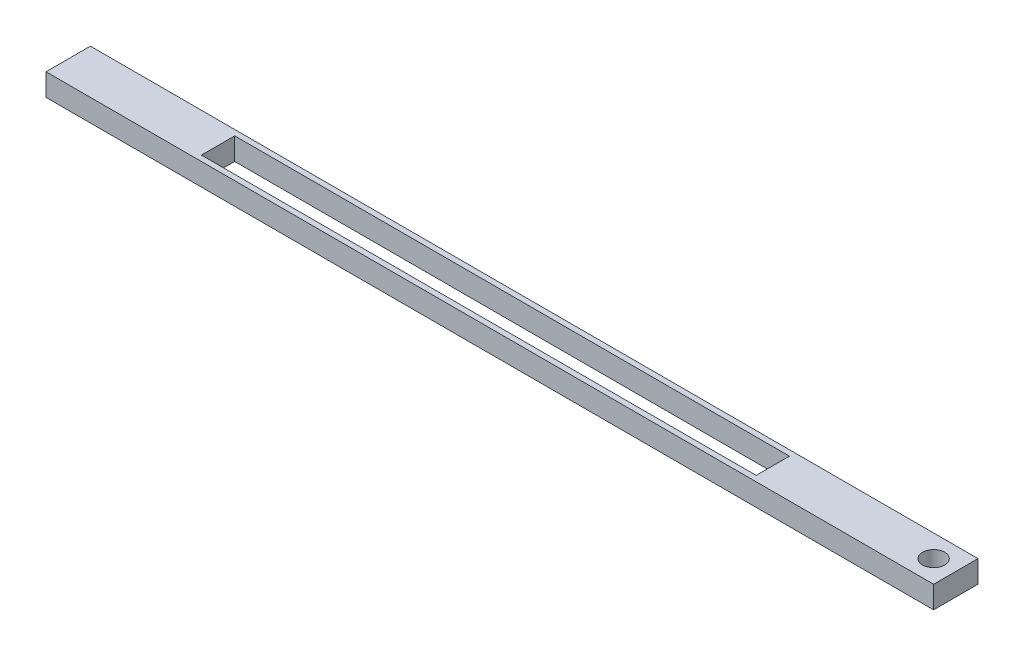
ISO-10303-21;
HEADER;
FILE_DESCRIPTION(('STEP AP214'),'2;1');
FILE_NAME('part.step','',(''),(''),'','','');
FILE_SCHEMA(('AUTOMOTIVE_DESIGN { 1 0 10303 214 1 1 1 1 }'));
ENDSEC;
DATA;
#1=APPLICATION_CONTEXT('core data for automotive mechanical design processes');
#2=APPLICATION_PROTOCOL_DEFINITION('international standard','automotive_design',2000,#1);
#3=PRODUCT_CONTEXT('',#1,'mechanical');
#4=PRODUCT('Part','Part','',(#3));
#5=PRODUCT_RELATED_PRODUCT_CATEGORY('part','',(#4));
#6=PRODUCT_DEFINITION_FORMATION('','',#4);
#7=PRODUCT_DEFINITION_CONTEXT('part definition',#1,'design');
#8=PRODUCT_DEFINITION('design','',#6,#7);
#9=PRODUCT_DEFINITION_SHAPE('','',#8);
#10=(LENGTH_UNIT() NAMED_UNIT(*) SI_UNIT(.MILLI.,.METRE.));
#11=(NAMED_UNIT(*) PLANE_ANGLE_UNIT() SI_UNIT($,.RADIAN.));
#12=(NAMED_UNIT(*) SI_UNIT($,.STERADIAN.) SOLID_ANGLE_UNIT());
#13=UNCERTAINTY_MEASURE_WITH_UNIT(LENGTH_MEASURE(1.E-05),#10,'distance_accuracy_value','');
#14=(GEOMETRIC_REPRESENTATION_CONTEXT(3) GLOBAL_UNCERTAINTY_ASSIGNED_CONTEXT((#13)) GLOBAL_UNIT_ASSIGNED_CONTEXT((#10,
#11,#12)) REPRESENTATION_CONTEXT('',''));
#15=CARTESIAN_POINT('',(0.,0.,0.));
#16=DIRECTION('',(0.,0.,1.));
#17=DIRECTION('',(1.,0.,0.));
#18=AXIS2_PLACEMENT_3D('',#15,#16,#17);
#19=CARTESIAN_POINT('',(200.,-5.,20.));
#20=DIRECTION('',(-1.,0.,0.));
#21=DIRECTION('',(0.,0.,1.));
#22=AXIS2_PLACEMENT_3D('',#19,#20,#21);
#23=PLANE('',#22);
#24=DIRECTION('',(0.,1.,0.));
#25=VECTOR('',#24,1.);
#26=CARTESIAN_POINT('',(200.,-5.,0.));
#27=LINE('',#26,#25);
#28=CARTESIAN_POINT('',(200.,-5.,0.));
#29=VERTEX_POINT('',#28);
#30=CARTESIAN_POINT('',(200.,5.,0.));
#31=VERTEX_POINT('',#30);
#32=EDGE_CURVE('E136',#29,#31,#27,.T.);
#33=ORIENTED_EDGE('',*,*,#32,.T.);
#34=DIRECTION('',(0.,0.,-1.));
#35=VECTOR('',#34,1.);
#36=CARTESIAN_POINT('',(200.,5.,20.));
#37=LINE('',#36,#35);
#38=CARTESIAN_POINT('',(200.,5.,20.));
#39=VERTEX_POINT('',#38);
#40=EDGE_CURVE('E178',#39,#31,#37,.T.);
#41=ORIENTED_EDGE('',*,*,#40,.F.);
#42=DIRECTION('',(0.,1.,0.));
#43=VECTOR('',#42,1.);
#44=CARTESIAN_POINT('',(200.,-5.,20.));
#45=LINE('',#44,#43);
#46=CARTESIAN_POINT('',(200.,-5.,20.));
#47=VERTEX_POINT('',#46);
#48=EDGE_CURVE('E141',#47,#39,#45,.T.);
#49=ORIENTED_EDGE('',*,*,#48,.F.);
#50=DIRECTION('',(0.,0.,-1.));
#51=VECTOR('',#50,1.);
#52=CARTESIAN_POINT('',(200.,-5.,20.));
#53=LINE('',#52,#51);
#54=EDGE_CURVE('E155',#47,#29,#53,.T.);
#55=ORIENTED_EDGE('',*,*,#54,.T.);
#56=EDGE_LOOP('',(#33,#41,#49,#55));
#57=FACE_BOUND('',#56,.T.);
#58=ADVANCED_FACE('F39',(#57),#23,.F.);
#59=CARTESIAN_POINT('',(-200.,5.,20.));
#60=DIRECTION('',(0.,-1.,0.));
#61=DIRECTION('',(0.,0.,-1.));
#62=AXIS2_PLACEMENT_3D('',#59,#60,#61);
#63=PLANE('',#62);
#64=CARTESIAN_POINT('',(190.,5.,10.));
#65=DIRECTION('',(0.,1.,0.));
#66=DIRECTION('',(0.,0.,1.));
#67=AXIS2_PLACEMENT_3D('',#64,#65,#66);
#68=CIRCLE('',#67,5.00000000000002);
#69=CARTESIAN_POINT('',(190.,5.,15.));
#70=VERTEX_POINT('',#69);
#71=EDGE_CURVE('E298',#70,#70,#68,.T.);
#72=ORIENTED_EDGE('',*,*,#71,.F.);
#73=EDGE_LOOP('',(#72));
#74=FACE_BOUND('',#73,.T.);
#75=DIRECTION('',(-1.,0.,0.));
#76=VECTOR('',#75,1.);
#77=CARTESIAN_POINT('',(-132.46371867266,5.,2.5));
#78=LINE('',#77,#76);
#79=CARTESIAN_POINT('',(117.53628132734,5.,2.5));
#80=VERTEX_POINT('',#79);
#81=CARTESIAN_POINT('',(-132.46371867266,5.,2.5));
#82=VERTEX_POINT('',#81);
#83=EDGE_CURVE('E118',#80,#82,#78,.T.);
#84=ORIENTED_EDGE('',*,*,#83,.F.);
#85=DIRECTION('',(0.,0.,-1.));
#86=VECTOR('',#85,1.);
#87=CARTESIAN_POINT('',(117.53628132734,5.,17.5));
#88=LINE('',#87,#86);
#89=CARTESIAN_POINT('',(117.53628132734,5.,17.5));
#90=VERTEX_POINT('',#89);
#91=EDGE_CURVE('E55',#90,#80,#88,.T.);
#92=ORIENTED_EDGE('',*,*,#91,.F.);
#93=DIRECTION('',(1.,0.,0.));
#94=VECTOR('',#93,1.);
#95=CARTESIAN_POINT('',(-132.46371867266,5.,17.5));
#96=LINE('',#95,#94);
#97=CARTESIAN_POINT('',(-132.46371867266,5.,17.5));
#98=VERTEX_POINT('',#97);
#99=EDGE_CURVE('E126',#98,#90,#96,.T.);
#100=ORIENTED_EDGE('',*,*,#99,.F.);
#101=DIRECTION('',(0.,0.,1.));
#102=VECTOR('',#101,1.);
#103=CARTESIAN_POINT('',(-132.46371867266,5.,17.5));
#104=LINE('',#103,#102);
#105=EDGE_CURVE('E108',#82,#98,#104,.T.);
#106=ORIENTED_EDGE('',*,*,#105,.F.);
#107=EDGE_LOOP('',(#84,#92,#100,#106));
#108=FACE_BOUND('',#107,.T.);
#109=DIRECTION('',(-1.,0.,0.));
#110=VECTOR('',#109,1.);
#111=CARTESIAN_POINT('',(-200.,5.,0.));
#112=LINE('',#111,#110);
#113=CARTESIAN_POINT('',(-200.,5.,0.));
#114=VERTEX_POINT('',#113);
#115=EDGE_CURVE('E159',#31,#114,#112,.T.);
#116=ORIENTED_EDGE('',*,*,#115,.T.);
#117=DIRECTION('',(0.,0.,-1.));
#118=VECTOR('',#117,1.);
#119=CARTESIAN_POINT('',(-200.,5.,20.));
#120=LINE('',#119,#118);
#121=CARTESIAN_POINT('',(-200.,5.,20.));
#122=VERTEX_POINT('',#121);
#123=EDGE_CURVE('E174',#122,#114,#120,.T.);
#124=ORIENTED_EDGE('',*,*,#123,.F.);
#125=DIRECTION('',(-1.,0.,0.));
#126=VECTOR('',#125,1.);
#127=CARTESIAN_POINT('',(-200.,5.,20.));
#128=LINE('',#127,#126);
#129=EDGE_CURVE('E145',#39,#122,#128,.T.);
#130=ORIENTED_EDGE('',*,*,#129,.F.);
#131=ORIENTED_EDGE('',*,*,#40,.T.);
#132=EDGE_LOOP('',(#116,#124,#130,#131));
#133=FACE_BOUND('',#132,.T.);
#134=ADVANCED_FACE('F123',(#74,#108,#133),#63,.F.);
#135=CARTESIAN_POINT('',(-200.,-5.,20.));
#136=DIRECTION('',(1.,0.,0.));
#137=DIRECTION('',(0.,0.,-1.));
#138=AXIS2_PLACEMENT_3D('',#135,#136,#137);
#139=PLANE('',#138);
#140=DIRECTION('',(0.,-1.,0.));
#141=VECTOR('',#140,1.);
#142=CARTESIAN_POINT('',(-200.,-5.,0.));
#143=LINE('',#142,#141);
#144=CARTESIAN_POINT('',(-200.,-5.,0.));
#145=VERTEX_POINT('',#144);
#146=EDGE_CURVE('E162',#114,#145,#143,.T.);
#147=ORIENTED_EDGE('',*,*,#146,.T.);
#148=DIRECTION('',(0.,0.,-1.));
#149=VECTOR('',#148,1.);
#150=CARTESIAN_POINT('',(-200.,-5.,20.));
#151=LINE('',#150,#149);
#152=CARTESIAN_POINT('',(-200.,-5.,20.));
#153=VERTEX_POINT('',#152);
#154=EDGE_CURVE('E170',#153,#145,#151,.T.);
#155=ORIENTED_EDGE('',*,*,#154,.F.);
#156=DIRECTION('',(0.,-1.,0.));
#157=VECTOR('',#156,1.);
#158=CARTESIAN_POINT('',(-200.,-5.,20.));
#159=LINE('',#158,#157);
#160=EDGE_CURVE('E149',#122,#153,#159,.T.);
#161=ORIENTED_EDGE('',*,*,#160,.F.);
#162=ORIENTED_EDGE('',*,*,#123,.T.);
#163=EDGE_LOOP('',(#147,#155,#161,#162));
#164=FACE_BOUND('',#163,.T.);
#165=ADVANCED_FACE('F214',(#164),#139,.F.);
#166=CARTESIAN_POINT('',(-200.,-5.,20.));
#167=DIRECTION('',(0.,1.,0.));
#168=DIRECTION('',(0.,0.,1.));
#169=AXIS2_PLACEMENT_3D('',#166,#167,#168);
#170=PLANE('',#169);
#171=CARTESIAN_POINT('',(190.,-5.,10.));
#172=DIRECTION('',(0.,1.,0.));
#173=DIRECTION('',(0.,0.,1.));
#174=AXIS2_PLACEMENT_3D('',#171,#172,#173);
#175=CIRCLE('',#174,5.00000000000002);
#176=CARTESIAN_POINT('',(190.,-5.,15.));
#177=VERTEX_POINT('',#176);
#178=EDGE_CURVE('E42',#177,#177,#175,.T.);
#179=ORIENTED_EDGE('',*,*,#178,.T.);
#180=EDGE_LOOP('',(#179));
#181=FACE_BOUND('',#180,.T.);
#182=DIRECTION('',(1.,0.,0.));
#183=VECTOR('',#182,1.);
#184=CARTESIAN_POINT('',(-200.,-5.,17.5));
#185=LINE('',#184,#183);
#186=CARTESIAN_POINT('',(-132.46371867266,-5.,17.5));
#187=VERTEX_POINT('',#186);
#188=CARTESIAN_POINT('',(117.53628132734,-5.,17.5));
#189=VERTEX_POINT('',#188);
#190=EDGE_CURVE('E48',#187,#189,#185,.T.);
#191=ORIENTED_EDGE('',*,*,#190,.T.);
#192=DIRECTION('',(0.,0.,-1.));
#193=VECTOR('',#192,1.);
#194=CARTESIAN_POINT('',(117.53628132734,-5.,20.));
#195=LINE('',#194,#193);
#196=CARTESIAN_POINT('',(117.53628132734,-5.,2.5));
#197=VERTEX_POINT('',#196);
#198=EDGE_CURVE('E11',#189,#197,#195,.T.);
#199=ORIENTED_EDGE('',*,*,#198,.T.);
#200=DIRECTION('',(-1.,0.,0.));
#201=VECTOR('',#200,1.);
#202=CARTESIAN_POINT('',(-200.,-5.,2.5));
#203=LINE('',#202,#201);
#204=CARTESIAN_POINT('',(-132.46371867266,-5.,2.5));
#205=VERTEX_POINT('',#204);
#206=EDGE_CURVE('E182',#197,#205,#203,.T.);
#207=ORIENTED_EDGE('',*,*,#206,.T.);
#208=DIRECTION('',(0.,0.,1.));
#209=VECTOR('',#208,1.);
#210=CARTESIAN_POINT('',(-132.46371867266,-5.,20.));
#211=LINE('',#210,#209);
#212=EDGE_CURVE('E111',#205,#187,#211,.T.);
#213=ORIENTED_EDGE('',*,*,#212,.T.);
#214=EDGE_LOOP('',(#191,#199,#207,#213));
#215=FACE_BOUND('',#214,.T.);
#216=DIRECTION('',(1.,0.,0.));
#217=VECTOR('',#216,1.);
#218=CARTESIAN_POINT('',(-200.,-5.,0.));
#219=LINE('',#218,#217);
#220=EDGE_CURVE('E146',#145,#29,#219,.T.);
#221=ORIENTED_EDGE('',*,*,#220,.T.);
#222=ORIENTED_EDGE('',*,*,#54,.F.);
#223=DIRECTION('',(1.,0.,0.));
#224=VECTOR('',#223,1.);
#225=CARTESIAN_POINT('',(-200.,-5.,20.));
#226=LINE('',#225,#224);
#227=EDGE_CURVE('E152',#153,#47,#226,.T.);
#228=ORIENTED_EDGE('',*,*,#227,.F.);
#229=ORIENTED_EDGE('',*,*,#154,.T.);
#230=EDGE_LOOP('',(#221,#222,#228,#229));
#231=FACE_BOUND('',#230,.T.);
#232=ADVANCED_FACE('F190',(#181,#215,#231),#170,.F.);
#233=CARTESIAN_POINT('',(0.,0.,20.));
#234=DIRECTION('',(0.,0.,-1.));
#235=DIRECTION('',(-1.,0.,0.));
#236=AXIS2_PLACEMENT_3D('',#233,#234,#235);
#237=PLANE('',#236);
#238=ORIENTED_EDGE('',*,*,#48,.T.);
#239=ORIENTED_EDGE('',*,*,#129,.T.);
#240=ORIENTED_EDGE('',*,*,#160,.T.);
#241=ORIENTED_EDGE('',*,*,#227,.T.);
#242=EDGE_LOOP('',(#238,#239,#240,#241));
#243=FACE_BOUND('',#242,.T.);
#244=ADVANCED_FACE('F204',(#243),#237,.F.);
#245=CARTESIAN_POINT('',(0.,0.,0.));
#246=DIRECTION('',(0.,0.,-1.));
#247=DIRECTION('',(-1.,0.,0.));
#248=AXIS2_PLACEMENT_3D('',#245,#246,#247);
#249=PLANE('',#248);
#250=ORIENTED_EDGE('',*,*,#32,.F.);
#251=ORIENTED_EDGE('',*,*,#220,.F.);
#252=ORIENTED_EDGE('',*,*,#146,.F.);
#253=ORIENTED_EDGE('',*,*,#115,.F.);
#254=EDGE_LOOP('',(#250,#251,#252,#253));
#255=FACE_BOUND('',#254,.T.);
#256=ADVANCED_FACE('F197',(#255),#249,.T.);
#257=CARTESIAN_POINT('',(117.53628132734,-15.,17.5));
#258=DIRECTION('',(1.,0.,0.));
#259=DIRECTION('',(0.,0.,-1.));
#260=AXIS2_PLACEMENT_3D('',#257,#258,#259);
#261=PLANE('',#260);
#262=DIRECTION('',(0.,1.,0.));
#263=VECTOR('',#262,1.);
#264=CARTESIAN_POINT('',(117.53628132734,-15.,17.5));
#265=LINE('',#264,#263);
#266=EDGE_CURVE('E133',#189,#90,#265,.T.);
#267=ORIENTED_EDGE('',*,*,#266,.T.);
#268=ORIENTED_EDGE('',*,*,#91,.T.);
#269=DIRECTION('',(0.,1.,0.));
#270=VECTOR('',#269,1.);
#271=CARTESIAN_POINT('',(117.53628132734,-15.,2.5));
#272=LINE('',#271,#270);
#273=EDGE_CURVE('E115',#197,#80,#272,.T.);
#274=ORIENTED_EDGE('',*,*,#273,.F.);
#275=ORIENTED_EDGE('',*,*,#198,.F.);
#276=EDGE_LOOP('',(#267,#268,#274,#275));
#277=FACE_BOUND('',#276,.T.);
#278=ADVANCED_FACE('F195',(#277),#261,.F.);
#279=CARTESIAN_POINT('',(-132.46371867266,-15.,17.5));
#280=DIRECTION('',(0.,0.,1.));
#281=DIRECTION('',(1.,0.,0.));
#282=AXIS2_PLACEMENT_3D('',#279,#280,#281);
#283=PLANE('',#282);
#284=DIRECTION('',(0.,1.,0.));
#285=VECTOR('',#284,1.);
#286=CARTESIAN_POINT('',(-132.46371867266,-15.,17.5));
#287=LINE('',#286,#285);
#288=EDGE_CURVE('E114',#187,#98,#287,.T.);
#289=ORIENTED_EDGE('',*,*,#288,.T.);
#290=ORIENTED_EDGE('',*,*,#99,.T.);
#291=ORIENTED_EDGE('',*,*,#266,.F.);
#292=ORIENTED_EDGE('',*,*,#190,.F.);
#293=EDGE_LOOP('',(#289,#290,#291,#292));
#294=FACE_BOUND('',#293,.T.);
#295=ADVANCED_FACE('F194',(#294),#283,.F.);
#296=CARTESIAN_POINT('',(-132.46371867266,-15.,17.5));
#297=DIRECTION('',(-1.,0.,0.));
#298=DIRECTION('',(0.,0.,1.));
#299=AXIS2_PLACEMENT_3D('',#296,#297,#298);
#300=PLANE('',#299);
#301=DIRECTION('',(0.,1.,0.));
#302=VECTOR('',#301,1.);
#303=CARTESIAN_POINT('',(-132.46371867266,-15.,2.5));
#304=LINE('',#303,#302);
#305=EDGE_CURVE('E63',#205,#82,#304,.T.);
#306=ORIENTED_EDGE('',*,*,#305,.T.);
#307=ORIENTED_EDGE('',*,*,#105,.T.);
#308=ORIENTED_EDGE('',*,*,#288,.F.);
#309=ORIENTED_EDGE('',*,*,#212,.F.);
#310=EDGE_LOOP('',(#306,#307,#308,#309));
#311=FACE_BOUND('',#310,.T.);
#312=ADVANCED_FACE('F105',(#311),#300,.F.);
#313=CARTESIAN_POINT('',(-132.46371867266,-15.,2.5));
#314=DIRECTION('',(0.,0.,-1.));
#315=DIRECTION('',(-1.,0.,0.));
#316=AXIS2_PLACEMENT_3D('',#313,#314,#315);
#317=PLANE('',#316);
#318=ORIENTED_EDGE('',*,*,#273,.T.);
#319=ORIENTED_EDGE('',*,*,#83,.T.);
#320=ORIENTED_EDGE('',*,*,#305,.F.);
#321=ORIENTED_EDGE('',*,*,#206,.F.);
#322=EDGE_LOOP('',(#318,#319,#320,#321));
#323=FACE_BOUND('',#322,.T.);
#324=ADVANCED_FACE('F119',(#323),#317,.F.);
#325=CARTESIAN_POINT('',(190.,-15.,10.));
#326=DIRECTION('',(0.,1.,0.));
#327=DIRECTION('',(0.,0.,1.));
#328=AXIS2_PLACEMENT_3D('',#325,#326,#327);
#329=CYLINDRICAL_SURFACE('',#328,5.00000000000002);
#330=ORIENTED_EDGE('',*,*,#71,.T.);
#331=EDGE_LOOP('',(#330));
#332=FACE_BOUND('',#331,.T.);
#333=ORIENTED_EDGE('',*,*,#178,.F.);
#334=EDGE_LOOP('',(#333));
#335=FACE_BOUND('',#334,.T.);
#336=ADVANCED_FACE('F271',(#332,#335),#329,.F.);
#337=CLOSED_SHELL('',(#58,#134,#165,#232,#244,#256,#278,#295,#312,#324,#336));
#338=MANIFOLD_SOLID_BREP('B2',#337);
#339=ADVANCED_BREP_SHAPE_REPRESENTATION('',(#18,#338),#14);
#340=SHAPE_DEFINITION_REPRESENTATION(#9,#339);
ENDSEC;
END-ISO-10303-21;
